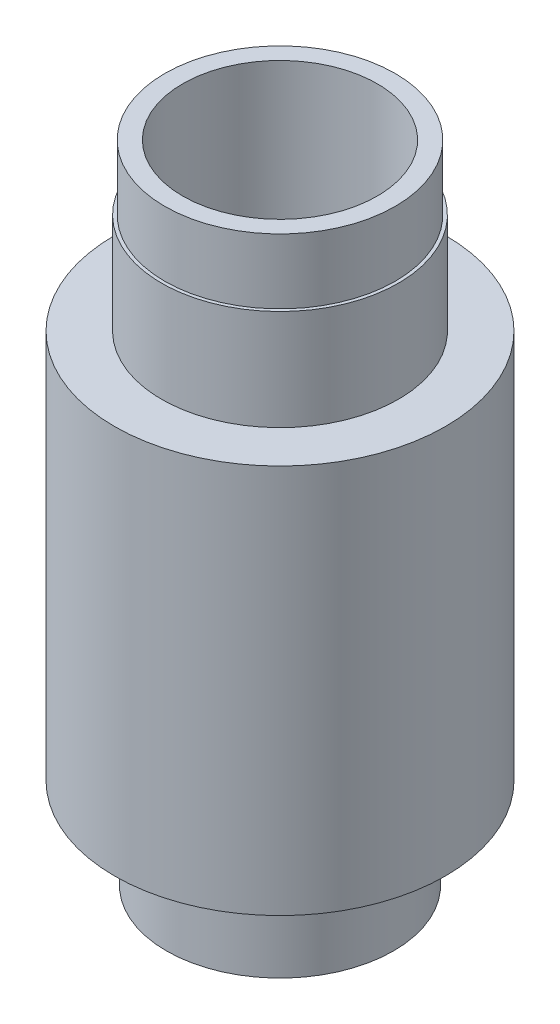
ISO-10303-21;
HEADER;
FILE_DESCRIPTION(('STEP AP214'),'2;1');
FILE_NAME('part.step','',(''),(''),'','','');
FILE_SCHEMA(('AUTOMOTIVE_DESIGN { 1 0 10303 214 1 1 1 1 }'));
ENDSEC;
DATA;
#1=APPLICATION_CONTEXT('core data for automotive mechanical design processes');
#2=APPLICATION_PROTOCOL_DEFINITION('international standard','automotive_design',2000,#1);
#3=PRODUCT_CONTEXT('',#1,'mechanical');
#4=PRODUCT('Part','Part','',(#3));
#5=PRODUCT_RELATED_PRODUCT_CATEGORY('part','',(#4));
#6=PRODUCT_DEFINITION_FORMATION('','',#4);
#7=PRODUCT_DEFINITION_CONTEXT('part definition',#1,'design');
#8=PRODUCT_DEFINITION('design','',#6,#7);
#9=PRODUCT_DEFINITION_SHAPE('','',#8);
#10=(LENGTH_UNIT() NAMED_UNIT(*) SI_UNIT(.MILLI.,.METRE.));
#11=(NAMED_UNIT(*) PLANE_ANGLE_UNIT() SI_UNIT($,.RADIAN.));
#12=(NAMED_UNIT(*) SI_UNIT($,.STERADIAN.) SOLID_ANGLE_UNIT());
#13=UNCERTAINTY_MEASURE_WITH_UNIT(LENGTH_MEASURE(1.E-05),#10,'distance_accuracy_value','');
#14=(GEOMETRIC_REPRESENTATION_CONTEXT(3) GLOBAL_UNCERTAINTY_ASSIGNED_CONTEXT((#13)) GLOBAL_UNIT_ASSIGNED_CONTEXT((#10,
#11,#12)) REPRESENTATION_CONTEXT('',''));
#15=CARTESIAN_POINT('',(0.,0.,0.));
#16=DIRECTION('',(0.,0.,1.));
#17=DIRECTION('',(1.,0.,0.));
#18=AXIS2_PLACEMENT_3D('',#15,#16,#17);
#19=CARTESIAN_POINT('',(0.,0.,0.));
#20=DIRECTION('',(0.,-1.,0.));
#21=DIRECTION('',(0.,0.,-1.));
#22=AXIS2_PLACEMENT_3D('',#19,#20,#21);
#23=PLANE('',#22);
#24=CARTESIAN_POINT('',(0.,0.,0.));
#25=DIRECTION('',(0.,-1.,0.));
#26=DIRECTION('',(0.,0.,-1.));
#27=AXIS2_PLACEMENT_3D('',#24,#25,#26);
#28=CIRCLE('',#27,3.5);
#29=CARTESIAN_POINT('',(0.,0.,-3.5));
#30=VERTEX_POINT('',#29);
#31=EDGE_CURVE('E10',#30,#30,#28,.T.);
#32=ORIENTED_EDGE('',*,*,#31,.T.);
#33=EDGE_LOOP('',(#32));
#34=FACE_BOUND('',#33,.T.);
#35=ADVANCED_FACE('F31',(#34),#23,.T.);
#36=CARTESIAN_POINT('',(0.,0.,0.));
#37=DIRECTION('',(0.,-1.,0.));
#38=DIRECTION('',(0.,0.,-1.));
#39=AXIS2_PLACEMENT_3D('',#36,#37,#38);
#40=CYLINDRICAL_SURFACE('',#39,3.5);
#41=CARTESIAN_POINT('',(0.,2.8,0.));
#42=DIRECTION('',(0.,-1.,0.));
#43=DIRECTION('',(0.,0.,-1.));
#44=AXIS2_PLACEMENT_3D('',#41,#42,#43);
#45=CIRCLE('',#44,3.5);
#46=CARTESIAN_POINT('',(0.,2.8,-3.5));
#47=VERTEX_POINT('',#46);
#48=EDGE_CURVE('E37',#47,#47,#45,.T.);
#49=ORIENTED_EDGE('',*,*,#48,.T.);
#50=EDGE_LOOP('',(#49));
#51=FACE_BOUND('',#50,.T.);
#52=ORIENTED_EDGE('',*,*,#31,.F.);
#53=EDGE_LOOP('',(#52));
#54=FACE_BOUND('',#53,.T.);
#55=ADVANCED_FACE('F116',(#51,#54),#40,.T.);
#56=CARTESIAN_POINT('',(3.5,2.8,0.));
#57=DIRECTION('',(0.,-1.,0.));
#58=DIRECTION('',(0.,0.,-1.));
#59=AXIS2_PLACEMENT_3D('',#56,#57,#58);
#60=PLANE('',#59);
#61=CARTESIAN_POINT('',(0.,2.8,0.));
#62=DIRECTION('',(0.,-1.,0.));
#63=DIRECTION('',(0.,0.,-1.));
#64=AXIS2_PLACEMENT_3D('',#61,#62,#63);
#65=CIRCLE('',#64,5.1);
#66=CARTESIAN_POINT('',(0.,2.8,-5.1));
#67=VERTEX_POINT('',#66);
#68=EDGE_CURVE('E41',#67,#67,#65,.T.);
#69=ORIENTED_EDGE('',*,*,#68,.T.);
#70=EDGE_LOOP('',(#69));
#71=FACE_BOUND('',#70,.T.);
#72=ORIENTED_EDGE('',*,*,#48,.F.);
#73=EDGE_LOOP('',(#72));
#74=FACE_BOUND('',#73,.T.);
#75=ADVANCED_FACE('F110',(#71,#74),#60,.T.);
#76=CARTESIAN_POINT('',(0.,0.,0.));
#77=DIRECTION('',(0.,-1.,0.));
#78=DIRECTION('',(0.,0.,-1.));
#79=AXIS2_PLACEMENT_3D('',#76,#77,#78);
#80=CYLINDRICAL_SURFACE('',#79,5.1);
#81=CARTESIAN_POINT('',(0.,14.8,0.));
#82=DIRECTION('',(0.,-1.,0.));
#83=DIRECTION('',(0.,0.,-1.));
#84=AXIS2_PLACEMENT_3D('',#81,#82,#83);
#85=CIRCLE('',#84,5.1);
#86=CARTESIAN_POINT('',(0.,14.8,-5.1));
#87=VERTEX_POINT('',#86);
#88=EDGE_CURVE('E45',#87,#87,#85,.T.);
#89=ORIENTED_EDGE('',*,*,#88,.T.);
#90=EDGE_LOOP('',(#89));
#91=FACE_BOUND('',#90,.T.);
#92=ORIENTED_EDGE('',*,*,#68,.F.);
#93=EDGE_LOOP('',(#92));
#94=FACE_BOUND('',#93,.T.);
#95=ADVANCED_FACE('F104',(#91,#94),#80,.T.);
#96=CARTESIAN_POINT('',(5.1,14.8,0.));
#97=DIRECTION('',(0.,1.,0.));
#98=DIRECTION('',(0.,0.,1.));
#99=AXIS2_PLACEMENT_3D('',#96,#97,#98);
#100=PLANE('',#99);
#101=CARTESIAN_POINT('',(0.,14.8,0.));
#102=DIRECTION('',(0.,-1.,0.));
#103=DIRECTION('',(0.,0.,-1.));
#104=AXIS2_PLACEMENT_3D('',#101,#102,#103);
#105=CIRCLE('',#104,3.65);
#106=CARTESIAN_POINT('',(0.,14.8,-3.65));
#107=VERTEX_POINT('',#106);
#108=EDGE_CURVE('E50',#107,#107,#105,.T.);
#109=ORIENTED_EDGE('',*,*,#108,.T.);
#110=EDGE_LOOP('',(#109));
#111=FACE_BOUND('',#110,.T.);
#112=ORIENTED_EDGE('',*,*,#88,.F.);
#113=EDGE_LOOP('',(#112));
#114=FACE_BOUND('',#113,.T.);
#115=ADVANCED_FACE('F98',(#111,#114),#100,.T.);
#116=CARTESIAN_POINT('',(0.,0.,0.));
#117=DIRECTION('',(0.,-1.,0.));
#118=DIRECTION('',(0.,0.,-1.));
#119=AXIS2_PLACEMENT_3D('',#116,#117,#118);
#120=CYLINDRICAL_SURFACE('',#119,3.65);
#121=CARTESIAN_POINT('',(0.,17.9,0.));
#122=DIRECTION('',(0.,-1.,0.));
#123=DIRECTION('',(0.,0.,-1.));
#124=AXIS2_PLACEMENT_3D('',#121,#122,#123);
#125=CIRCLE('',#124,3.65);
#126=CARTESIAN_POINT('',(0.,17.9,-3.65));
#127=VERTEX_POINT('',#126);
#128=EDGE_CURVE('E53',#127,#127,#125,.T.);
#129=ORIENTED_EDGE('',*,*,#128,.T.);
#130=EDGE_LOOP('',(#129));
#131=FACE_BOUND('',#130,.T.);
#132=ORIENTED_EDGE('',*,*,#108,.F.);
#133=EDGE_LOOP('',(#132));
#134=FACE_BOUND('',#133,.T.);
#135=ADVANCED_FACE('F92',(#131,#134),#120,.T.);
#136=CARTESIAN_POINT('',(3.65,17.9,0.));
#137=DIRECTION('',(0.,1.,0.));
#138=DIRECTION('',(0.,0.,1.));
#139=AXIS2_PLACEMENT_3D('',#136,#137,#138);
#140=PLANE('',#139);
#141=CARTESIAN_POINT('',(0.,17.9,0.));
#142=DIRECTION('',(0.,-1.,0.));
#143=DIRECTION('',(0.,0.,-1.));
#144=AXIS2_PLACEMENT_3D('',#141,#142,#143);
#145=CIRCLE('',#144,3.55);
#146=CARTESIAN_POINT('',(0.,17.9,-3.55));
#147=VERTEX_POINT('',#146);
#148=EDGE_CURVE('E56',#147,#147,#145,.T.);
#149=ORIENTED_EDGE('',*,*,#148,.T.);
#150=EDGE_LOOP('',(#149));
#151=FACE_BOUND('',#150,.T.);
#152=ORIENTED_EDGE('',*,*,#128,.F.);
#153=EDGE_LOOP('',(#152));
#154=FACE_BOUND('',#153,.T.);
#155=ADVANCED_FACE('F86',(#151,#154),#140,.T.);
#156=CARTESIAN_POINT('',(0.,0.,0.));
#157=DIRECTION('',(0.,-1.,0.));
#158=DIRECTION('',(0.,0.,-1.));
#159=AXIS2_PLACEMENT_3D('',#156,#157,#158);
#160=CYLINDRICAL_SURFACE('',#159,3.55);
#161=CARTESIAN_POINT('',(0.,19.9,0.));
#162=DIRECTION('',(0.,-1.,0.));
#163=DIRECTION('',(0.,0.,-1.));
#164=AXIS2_PLACEMENT_3D('',#161,#162,#163);
#165=CIRCLE('',#164,3.55);
#166=CARTESIAN_POINT('',(0.,19.9,-3.55));
#167=VERTEX_POINT('',#166);
#168=EDGE_CURVE('E59',#167,#167,#165,.T.);
#169=ORIENTED_EDGE('',*,*,#168,.T.);
#170=EDGE_LOOP('',(#169));
#171=FACE_BOUND('',#170,.T.);
#172=ORIENTED_EDGE('',*,*,#148,.F.);
#173=EDGE_LOOP('',(#172));
#174=FACE_BOUND('',#173,.T.);
#175=ADVANCED_FACE('F80',(#171,#174),#160,.T.);
#176=CARTESIAN_POINT('',(3.55,19.9,0.));
#177=DIRECTION('',(0.,1.,0.));
#178=DIRECTION('',(0.,0.,1.));
#179=AXIS2_PLACEMENT_3D('',#176,#177,#178);
#180=PLANE('',#179);
#181=CARTESIAN_POINT('',(0.,19.9,0.));
#182=DIRECTION('',(0.,1.,0.));
#183=DIRECTION('',(0.,0.,1.));
#184=AXIS2_PLACEMENT_3D('',#181,#182,#183);
#185=CIRCLE('',#184,3.);
#186=CARTESIAN_POINT('',(0.,19.9,3.));
#187=VERTEX_POINT('',#186);
#188=EDGE_CURVE('E63',#187,#187,#185,.T.);
#189=ORIENTED_EDGE('',*,*,#188,.F.);
#190=EDGE_LOOP('',(#189));
#191=FACE_BOUND('',#190,.T.);
#192=ORIENTED_EDGE('',*,*,#168,.F.);
#193=EDGE_LOOP('',(#192));
#194=FACE_BOUND('',#193,.T.);
#195=ADVANCED_FACE('F74',(#191,#194),#180,.T.);
#196=CARTESIAN_POINT('',(0.,14.9,0.));
#197=DIRECTION('',(0.,1.,0.));
#198=DIRECTION('',(0.,0.,1.));
#199=AXIS2_PLACEMENT_3D('',#196,#197,#198);
#200=CYLINDRICAL_SURFACE('',#199,3.);
#201=CARTESIAN_POINT('',(0.,14.9,0.));
#202=DIRECTION('',(0.,1.,0.));
#203=DIRECTION('',(0.,0.,1.));
#204=AXIS2_PLACEMENT_3D('',#201,#202,#203);
#205=CIRCLE('',#204,3.);
#206=CARTESIAN_POINT('',(0.,14.9,3.));
#207=VERTEX_POINT('',#206);
#208=EDGE_CURVE('E62',#207,#207,#205,.T.);
#209=ORIENTED_EDGE('',*,*,#208,.F.);
#210=EDGE_LOOP('',(#209));
#211=FACE_BOUND('',#210,.T.);
#212=ORIENTED_EDGE('',*,*,#188,.T.);
#213=EDGE_LOOP('',(#212));
#214=FACE_BOUND('',#213,.T.);
#215=ADVANCED_FACE('F71',(#211,#214),#200,.F.);
#216=CARTESIAN_POINT('',(0.,14.9,0.));
#217=DIRECTION('',(0.,1.,0.));
#218=DIRECTION('',(0.,0.,1.));
#219=AXIS2_PLACEMENT_3D('',#216,#217,#218);
#220=PLANE('',#219);
#221=ORIENTED_EDGE('',*,*,#208,.T.);
#222=EDGE_LOOP('',(#221));
#223=FACE_BOUND('',#222,.T.);
#224=ADVANCED_FACE('F69',(#223),#220,.T.);
#225=CLOSED_SHELL('',(#35,#55,#75,#95,#115,#135,#155,#175,#195,#215,#224));
#226=MANIFOLD_SOLID_BREP('B2',#225);
#227=ADVANCED_BREP_SHAPE_REPRESENTATION('',(#18,#226),#14);
#228=SHAPE_DEFINITION_REPRESENTATION(#9,#227);
ENDSEC;
END-ISO-10303-21;
